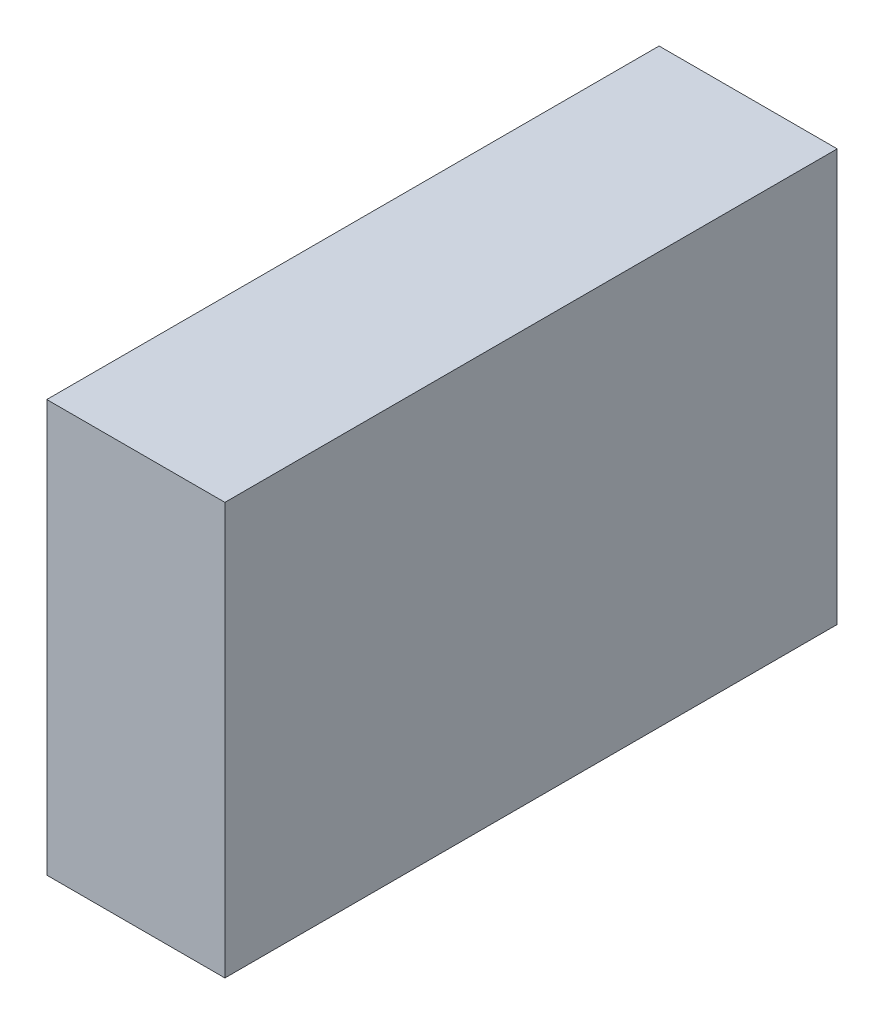
ISO-10303-21;
HEADER;
FILE_DESCRIPTION(('STEP AP214'),'2;1');
FILE_NAME('part.step','',(''),(''),'','','');
FILE_SCHEMA(('AUTOMOTIVE_DESIGN { 1 0 10303 214 1 1 1 1 }'));
ENDSEC;
DATA;
#1=APPLICATION_CONTEXT('core data for automotive mechanical design processes');
#2=APPLICATION_PROTOCOL_DEFINITION('international standard','automotive_design',2000,#1);
#3=PRODUCT_CONTEXT('',#1,'mechanical');
#4=PRODUCT('Part','Part','',(#3));
#5=PRODUCT_RELATED_PRODUCT_CATEGORY('part','',(#4));
#6=PRODUCT_DEFINITION_FORMATION('','',#4);
#7=PRODUCT_DEFINITION_CONTEXT('part definition',#1,'design');
#8=PRODUCT_DEFINITION('design','',#6,#7);
#9=PRODUCT_DEFINITION_SHAPE('','',#8);
#10=(LENGTH_UNIT() NAMED_UNIT(*) SI_UNIT(.MILLI.,.METRE.));
#11=(NAMED_UNIT(*) PLANE_ANGLE_UNIT() SI_UNIT($,.RADIAN.));
#12=(NAMED_UNIT(*) SI_UNIT($,.STERADIAN.) SOLID_ANGLE_UNIT());
#13=UNCERTAINTY_MEASURE_WITH_UNIT(LENGTH_MEASURE(1.E-05),#10,'distance_accuracy_value','');
#14=(GEOMETRIC_REPRESENTATION_CONTEXT(3) GLOBAL_UNCERTAINTY_ASSIGNED_CONTEXT((#13)) GLOBAL_UNIT_ASSIGNED_CONTEXT((#10,
#11,#12)) REPRESENTATION_CONTEXT('',''));
#15=CARTESIAN_POINT('',(0.,0.,0.));
#16=DIRECTION('',(0.,0.,1.));
#17=DIRECTION('',(1.,0.,0.));
#18=AXIS2_PLACEMENT_3D('',#15,#16,#17);
#19=CARTESIAN_POINT('',(16.,18.5,-27.5));
#20=DIRECTION('',(0.,0.,1.));
#21=DIRECTION('',(1.,0.,0.));
#22=AXIS2_PLACEMENT_3D('',#19,#20,#21);
#23=PLANE('',#22);
#24=DIRECTION('',(0.,1.,0.));
#25=VECTOR('',#24,1.);
#26=CARTESIAN_POINT('',(0.,18.5,-27.5));
#27=LINE('',#26,#25);
#28=CARTESIAN_POINT('',(0.,-18.5,-27.5));
#29=VERTEX_POINT('',#28);
#30=CARTESIAN_POINT('',(0.,18.5,-27.5));
#31=VERTEX_POINT('',#30);
#32=EDGE_CURVE('E96',#29,#31,#27,.T.);
#33=ORIENTED_EDGE('',*,*,#32,.T.);
#34=DIRECTION('',(-1.,0.,0.));
#35=VECTOR('',#34,1.);
#36=CARTESIAN_POINT('',(16.,18.5,-27.5));
#37=LINE('',#36,#35);
#38=CARTESIAN_POINT('',(16.,18.5,-27.5));
#39=VERTEX_POINT('',#38);
#40=EDGE_CURVE('E11',#39,#31,#37,.T.);
#41=ORIENTED_EDGE('',*,*,#40,.F.);
#42=DIRECTION('',(0.,1.,0.));
#43=VECTOR('',#42,1.);
#44=CARTESIAN_POINT('',(16.,18.5,-27.5));
#45=LINE('',#44,#43);
#46=CARTESIAN_POINT('',(16.,-18.5,-27.5));
#47=VERTEX_POINT('',#46);
#48=EDGE_CURVE('E84',#47,#39,#45,.T.);
#49=ORIENTED_EDGE('',*,*,#48,.F.);
#50=DIRECTION('',(-1.,0.,0.));
#51=VECTOR('',#50,1.);
#52=CARTESIAN_POINT('',(16.,-18.5,-27.5));
#53=LINE('',#52,#51);
#54=EDGE_CURVE('E92',#47,#29,#53,.T.);
#55=ORIENTED_EDGE('',*,*,#54,.T.);
#56=EDGE_LOOP('',(#33,#41,#49,#55));
#57=FACE_BOUND('',#56,.T.);
#58=ADVANCED_FACE('F33',(#57),#23,.F.);
#59=CARTESIAN_POINT('',(16.,18.5,27.5));
#60=DIRECTION('',(0.,-1.,0.));
#61=DIRECTION('',(0.,0.,-1.));
#62=AXIS2_PLACEMENT_3D('',#59,#60,#61);
#63=PLANE('',#62);
#64=DIRECTION('',(0.,0.,1.));
#65=VECTOR('',#64,1.);
#66=CARTESIAN_POINT('',(0.,18.5,27.5));
#67=LINE('',#66,#65);
#68=CARTESIAN_POINT('',(0.,18.5,27.5));
#69=VERTEX_POINT('',#68);
#70=EDGE_CURVE('E88',#31,#69,#67,.T.);
#71=ORIENTED_EDGE('',*,*,#70,.T.);
#72=DIRECTION('',(-1.,0.,0.));
#73=VECTOR('',#72,1.);
#74=CARTESIAN_POINT('',(16.,18.5,27.5));
#75=LINE('',#74,#73);
#76=CARTESIAN_POINT('',(16.,18.5,27.5));
#77=VERTEX_POINT('',#76);
#78=EDGE_CURVE('E41',#77,#69,#75,.T.);
#79=ORIENTED_EDGE('',*,*,#78,.F.);
#80=DIRECTION('',(0.,0.,1.));
#81=VECTOR('',#80,1.);
#82=CARTESIAN_POINT('',(16.,18.5,27.5));
#83=LINE('',#82,#81);
#84=EDGE_CURVE('E79',#39,#77,#83,.T.);
#85=ORIENTED_EDGE('',*,*,#84,.F.);
#86=ORIENTED_EDGE('',*,*,#40,.T.);
#87=EDGE_LOOP('',(#71,#79,#85,#86));
#88=FACE_BOUND('',#87,.T.);
#89=ADVANCED_FACE('F87',(#88),#63,.F.);
#90=CARTESIAN_POINT('',(16.,18.5,27.5));
#91=DIRECTION('',(0.,0.,-1.));
#92=DIRECTION('',(-1.,0.,0.));
#93=AXIS2_PLACEMENT_3D('',#90,#91,#92);
#94=PLANE('',#93);
#95=DIRECTION('',(0.,-1.,0.));
#96=VECTOR('',#95,1.);
#97=CARTESIAN_POINT('',(0.,18.5,27.5));
#98=LINE('',#97,#96);
#99=CARTESIAN_POINT('',(0.,-18.5,27.5));
#100=VERTEX_POINT('',#99);
#101=EDGE_CURVE('E66',#69,#100,#98,.T.);
#102=ORIENTED_EDGE('',*,*,#101,.T.);
#103=DIRECTION('',(-1.,0.,0.));
#104=VECTOR('',#103,1.);
#105=CARTESIAN_POINT('',(16.,-18.5,27.5));
#106=LINE('',#105,#104);
#107=CARTESIAN_POINT('',(16.,-18.5,27.5));
#108=VERTEX_POINT('',#107);
#109=EDGE_CURVE('E89',#108,#100,#106,.T.);
#110=ORIENTED_EDGE('',*,*,#109,.F.);
#111=DIRECTION('',(0.,-1.,0.));
#112=VECTOR('',#111,1.);
#113=CARTESIAN_POINT('',(16.,18.5,27.5));
#114=LINE('',#113,#112);
#115=EDGE_CURVE('E82',#77,#108,#114,.T.);
#116=ORIENTED_EDGE('',*,*,#115,.F.);
#117=ORIENTED_EDGE('',*,*,#78,.T.);
#118=EDGE_LOOP('',(#102,#110,#116,#117));
#119=FACE_BOUND('',#118,.T.);
#120=ADVANCED_FACE('F90',(#119),#94,.F.);
#121=CARTESIAN_POINT('',(16.,-18.5,27.5));
#122=DIRECTION('',(0.,1.,0.));
#123=DIRECTION('',(0.,0.,1.));
#124=AXIS2_PLACEMENT_3D('',#121,#122,#123);
#125=PLANE('',#124);
#126=DIRECTION('',(0.,0.,-1.));
#127=VECTOR('',#126,1.);
#128=CARTESIAN_POINT('',(0.,-18.5,27.5));
#129=LINE('',#128,#127);
#130=EDGE_CURVE('E72',#100,#29,#129,.T.);
#131=ORIENTED_EDGE('',*,*,#130,.T.);
#132=ORIENTED_EDGE('',*,*,#54,.F.);
#133=DIRECTION('',(0.,0.,-1.));
#134=VECTOR('',#133,1.);
#135=CARTESIAN_POINT('',(16.,-18.5,27.5));
#136=LINE('',#135,#134);
#137=EDGE_CURVE('E49',#108,#47,#136,.T.);
#138=ORIENTED_EDGE('',*,*,#137,.F.);
#139=ORIENTED_EDGE('',*,*,#109,.T.);
#140=EDGE_LOOP('',(#131,#132,#138,#139));
#141=FACE_BOUND('',#140,.T.);
#142=ADVANCED_FACE('F103',(#141),#125,.F.);
#143=CARTESIAN_POINT('',(16.,0.,0.));
#144=DIRECTION('',(1.,0.,0.));
#145=DIRECTION('',(0.,0.,-1.));
#146=AXIS2_PLACEMENT_3D('',#143,#144,#145);
#147=PLANE('',#146);
#148=ORIENTED_EDGE('',*,*,#48,.T.);
#149=ORIENTED_EDGE('',*,*,#84,.T.);
#150=ORIENTED_EDGE('',*,*,#115,.T.);
#151=ORIENTED_EDGE('',*,*,#137,.T.);
#152=EDGE_LOOP('',(#148,#149,#150,#151));
#153=FACE_BOUND('',#152,.T.);
#154=ADVANCED_FACE('F80',(#153),#147,.T.);
#155=CARTESIAN_POINT('',(0.,0.,0.));
#156=DIRECTION('',(1.,0.,0.));
#157=DIRECTION('',(0.,0.,-1.));
#158=AXIS2_PLACEMENT_3D('',#155,#156,#157);
#159=PLANE('',#158);
#160=ORIENTED_EDGE('',*,*,#32,.F.);
#161=ORIENTED_EDGE('',*,*,#130,.F.);
#162=ORIENTED_EDGE('',*,*,#101,.F.);
#163=ORIENTED_EDGE('',*,*,#70,.F.);
#164=EDGE_LOOP('',(#160,#161,#162,#163));
#165=FACE_BOUND('',#164,.T.);
#166=ADVANCED_FACE('F106',(#165),#159,.F.);
#167=CLOSED_SHELL('',(#58,#89,#120,#142,#154,#166));
#168=MANIFOLD_SOLID_BREP('B2',#167);
#169=ADVANCED_BREP_SHAPE_REPRESENTATION('',(#18,#168),#14);
#170=SHAPE_DEFINITION_REPRESENTATION(#9,#169);
ENDSEC;
END-ISO-10303-21;
